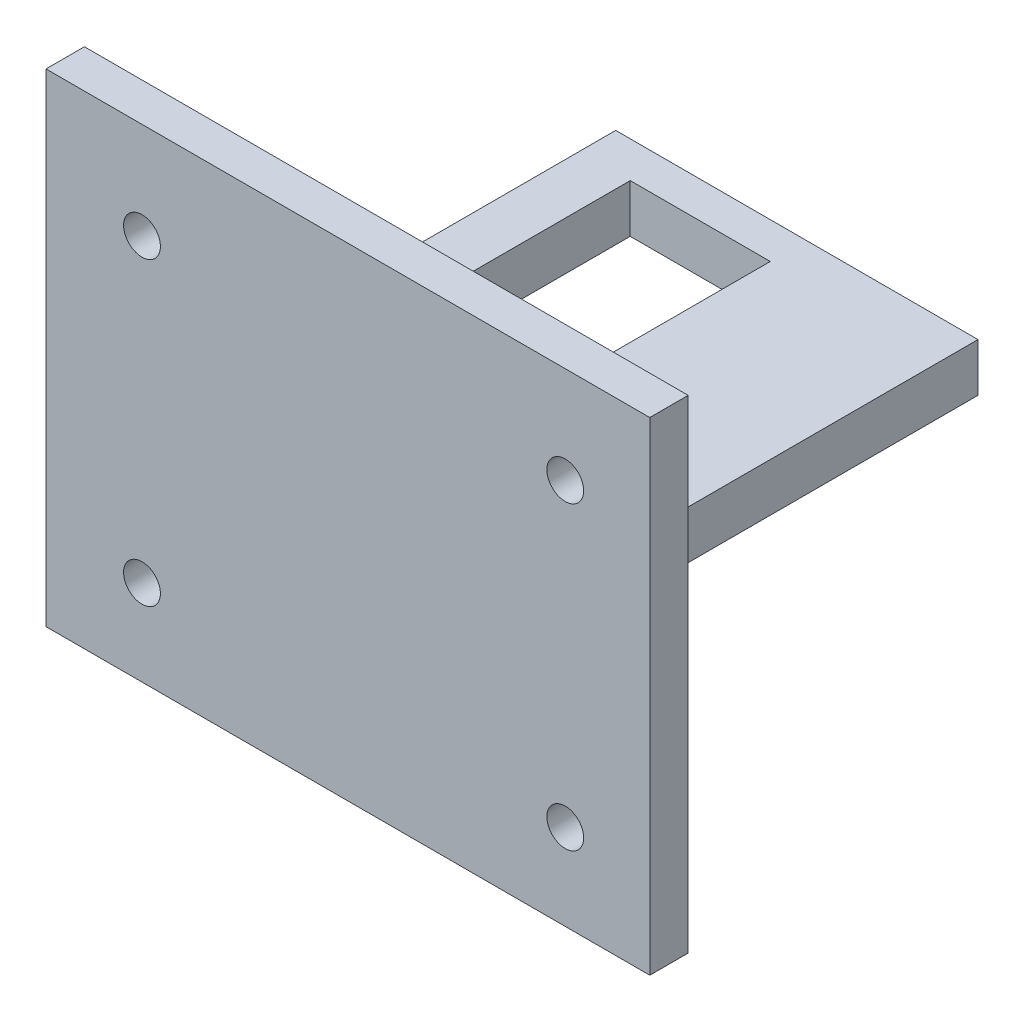
ISO-10303-21;
HEADER;
FILE_DESCRIPTION(('STEP AP214'),'2;1');
FILE_NAME('part.step','',(''),(''),'','','');
FILE_SCHEMA(('AUTOMOTIVE_DESIGN { 1 0 10303 214 1 1 1 1 }'));
ENDSEC;
DATA;
#1=APPLICATION_CONTEXT('core data for automotive mechanical design processes');
#2=APPLICATION_PROTOCOL_DEFINITION('international standard','automotive_design',2000,#1);
#3=PRODUCT_CONTEXT('',#1,'mechanical');
#4=PRODUCT('Part','Part','',(#3));
#5=PRODUCT_RELATED_PRODUCT_CATEGORY('part','',(#4));
#6=PRODUCT_DEFINITION_FORMATION('','',#4);
#7=PRODUCT_DEFINITION_CONTEXT('part definition',#1,'design');
#8=PRODUCT_DEFINITION('design','',#6,#7);
#9=PRODUCT_DEFINITION_SHAPE('','',#8);
#10=(LENGTH_UNIT() NAMED_UNIT(*) SI_UNIT(.MILLI.,.METRE.));
#11=(NAMED_UNIT(*) PLANE_ANGLE_UNIT() SI_UNIT($,.RADIAN.));
#12=(NAMED_UNIT(*) SI_UNIT($,.STERADIAN.) SOLID_ANGLE_UNIT());
#13=UNCERTAINTY_MEASURE_WITH_UNIT(LENGTH_MEASURE(1.E-05),#10,'distance_accuracy_value','');
#14=(GEOMETRIC_REPRESENTATION_CONTEXT(3) GLOBAL_UNCERTAINTY_ASSIGNED_CONTEXT((#13)) GLOBAL_UNIT_ASSIGNED_CONTEXT((#10,
#11,#12)) REPRESENTATION_CONTEXT('',''));
#15=CARTESIAN_POINT('',(0.,0.,0.));
#16=DIRECTION('',(0.,0.,1.));
#17=DIRECTION('',(1.,0.,0.));
#18=AXIS2_PLACEMENT_3D('',#15,#16,#17);
#19=CARTESIAN_POINT('',(15.,2.,-36.));
#20=DIRECTION('',(0.,-1.,0.));
#21=DIRECTION('',(0.,0.,-1.));
#22=AXIS2_PLACEMENT_3D('',#19,#20,#21);
#23=PLANE('',#22);
#24=DIRECTION('',(0.,0.,1.));
#25=VECTOR('',#24,1.);
#26=CARTESIAN_POINT('',(15.,2.,-36.));
#27=LINE('',#26,#25);
#28=CARTESIAN_POINT('',(15.,2.,-34.));
#29=VERTEX_POINT('',#28);
#30=CARTESIAN_POINT('',(15.,2.,0.));
#31=VERTEX_POINT('',#30);
#32=EDGE_CURVE('E158',#29,#31,#27,.T.);
#33=ORIENTED_EDGE('',*,*,#32,.F.);
#34=DIRECTION('',(-1.,0.,0.));
#35=VECTOR('',#34,1.);
#36=CARTESIAN_POINT('',(15.,2.,-34.));
#37=LINE('',#36,#35);
#38=CARTESIAN_POINT('',(-15.,2.,-34.));
#39=VERTEX_POINT('',#38);
#40=EDGE_CURVE('E55',#29,#39,#37,.T.);
#41=ORIENTED_EDGE('',*,*,#40,.T.);
#42=DIRECTION('',(0.,0.,1.));
#43=VECTOR('',#42,1.);
#44=CARTESIAN_POINT('',(-15.,2.,-36.));
#45=LINE('',#44,#43);
#46=CARTESIAN_POINT('',(-15.,2.,0.));
#47=VERTEX_POINT('',#46);
#48=EDGE_CURVE('E162',#39,#47,#45,.T.);
#49=ORIENTED_EDGE('',*,*,#48,.T.);
#50=DIRECTION('',(1.,0.,0.));
#51=VECTOR('',#50,1.);
#52=CARTESIAN_POINT('',(15.,2.,0.));
#53=LINE('',#52,#51);
#54=EDGE_CURVE('E247',#47,#31,#53,.T.);
#55=ORIENTED_EDGE('',*,*,#54,.T.);
#56=EDGE_LOOP('',(#33,#41,#49,#55));
#57=FACE_BOUND('',#56,.T.);
#58=CARTESIAN_POINT('',(-5.00000000000001,2.,-6.325));
#59=DIRECTION('',(0.,-1.,0.));
#60=DIRECTION('',(0.,0.,-1.));
#61=AXIS2_PLACEMENT_3D('',#58,#59,#60);
#62=CIRCLE('',#61,1.);
#63=CARTESIAN_POINT('',(-5.00000000000001,2.,-7.325));
#64=VERTEX_POINT('',#63);
#65=EDGE_CURVE('E217',#64,#64,#62,.T.);
#66=ORIENTED_EDGE('',*,*,#65,.T.);
#67=EDGE_LOOP('',(#66));
#68=FACE_BOUND('',#67,.T.);
#69=DIRECTION('',(0.,0.,-1.));
#70=VECTOR('',#69,1.);
#71=CARTESIAN_POINT('',(0.799999999999993,2.,-36.));
#72=LINE('',#71,#70);
#73=CARTESIAN_POINT('',(0.799999999999994,2.,-8.9));
#74=VERTEX_POINT('',#73);
#75=CARTESIAN_POINT('',(0.799999999999993,2.,-31.));
#76=VERTEX_POINT('',#75);
#77=EDGE_CURVE('E254',#74,#76,#72,.T.);
#78=ORIENTED_EDGE('',*,*,#77,.F.);
#79=DIRECTION('',(-1.,0.,0.));
#80=VECTOR('',#79,1.);
#81=CARTESIAN_POINT('',(15.,2.,-8.9));
#82=LINE('',#81,#80);
#83=CARTESIAN_POINT('',(-10.8,2.,-8.9));
#84=VERTEX_POINT('',#83);
#85=EDGE_CURVE('E260',#74,#84,#82,.T.);
#86=ORIENTED_EDGE('',*,*,#85,.T.);
#87=DIRECTION('',(0.,0.,-1.));
#88=VECTOR('',#87,1.);
#89=CARTESIAN_POINT('',(-10.8,2.,-36.));
#90=LINE('',#89,#88);
#91=CARTESIAN_POINT('',(-10.8,2.,-31.));
#92=VERTEX_POINT('',#91);
#93=EDGE_CURVE('E264',#84,#92,#90,.T.);
#94=ORIENTED_EDGE('',*,*,#93,.T.);
#95=DIRECTION('',(-1.,0.,0.));
#96=VECTOR('',#95,1.);
#97=CARTESIAN_POINT('',(15.,2.,-31.));
#98=LINE('',#97,#96);
#99=EDGE_CURVE('E268',#76,#92,#98,.T.);
#100=ORIENTED_EDGE('',*,*,#99,.F.);
#101=EDGE_LOOP('',(#78,#86,#94,#100));
#102=FACE_BOUND('',#101,.T.);
#103=ADVANCED_FACE('F39',(#57,#68,#102),#23,.F.);
#104=CARTESIAN_POINT('',(15.,-2.,-36.));
#105=DIRECTION('',(0.,1.,0.));
#106=DIRECTION('',(0.,0.,1.));
#107=AXIS2_PLACEMENT_3D('',#104,#105,#106);
#108=PLANE('',#107);
#109=DIRECTION('',(0.,0.,1.));
#110=VECTOR('',#109,1.);
#111=CARTESIAN_POINT('',(-15.,-2.,-36.));
#112=LINE('',#111,#110);
#113=CARTESIAN_POINT('',(-15.,-2.,-34.));
#114=VERTEX_POINT('',#113);
#115=CARTESIAN_POINT('',(-15.,-2.,-3.));
#116=VERTEX_POINT('',#115);
#117=EDGE_CURVE('E151',#114,#116,#112,.T.);
#118=ORIENTED_EDGE('',*,*,#117,.F.);
#119=DIRECTION('',(-1.,0.,0.));
#120=VECTOR('',#119,1.);
#121=CARTESIAN_POINT('',(15.,-2.,-34.));
#122=LINE('',#121,#120);
#123=CARTESIAN_POINT('',(15.,-2.,-34.));
#124=VERTEX_POINT('',#123);
#125=EDGE_CURVE('E137',#124,#114,#122,.T.);
#126=ORIENTED_EDGE('',*,*,#125,.F.);
#127=DIRECTION('',(0.,0.,1.));
#128=VECTOR('',#127,1.);
#129=CARTESIAN_POINT('',(15.,-2.,-36.));
#130=LINE('',#129,#128);
#131=CARTESIAN_POINT('',(15.,-2.,-3.));
#132=VERTEX_POINT('',#131);
#133=EDGE_CURVE('E150',#124,#132,#130,.T.);
#134=ORIENTED_EDGE('',*,*,#133,.T.);
#135=DIRECTION('',(-1.,0.,0.));
#136=VECTOR('',#135,1.);
#137=CARTESIAN_POINT('',(-15.,-2.,-3.));
#138=LINE('',#137,#136);
#139=EDGE_CURVE('E232',#132,#116,#138,.T.);
#140=ORIENTED_EDGE('',*,*,#139,.T.);
#141=EDGE_LOOP('',(#118,#126,#134,#140));
#142=FACE_BOUND('',#141,.T.);
#143=CARTESIAN_POINT('',(-5.00000000000001,-2.,-6.325));
#144=DIRECTION('',(0.,1.,0.));
#145=DIRECTION('',(0.,0.,1.));
#146=AXIS2_PLACEMENT_3D('',#143,#144,#145);
#147=CIRCLE('',#146,1.);
#148=CARTESIAN_POINT('',(-5.00000000000001,-2.,-5.325));
#149=VERTEX_POINT('',#148);
#150=EDGE_CURVE('E213',#149,#149,#147,.T.);
#151=ORIENTED_EDGE('',*,*,#150,.T.);
#152=EDGE_LOOP('',(#151));
#153=FACE_BOUND('',#152,.T.);
#154=DIRECTION('',(0.,0.,1.));
#155=VECTOR('',#154,1.);
#156=CARTESIAN_POINT('',(0.799999999999993,-2.,-36.));
#157=LINE('',#156,#155);
#158=CARTESIAN_POINT('',(0.799999999999994,-2.,-31.));
#159=VERTEX_POINT('',#158);
#160=CARTESIAN_POINT('',(0.799999999999994,-2.,-8.9));
#161=VERTEX_POINT('',#160);
#162=EDGE_CURVE('E229',#159,#161,#157,.T.);
#163=ORIENTED_EDGE('',*,*,#162,.F.);
#164=DIRECTION('',(1.,0.,0.));
#165=VECTOR('',#164,1.);
#166=CARTESIAN_POINT('',(15.,-2.,-31.));
#167=LINE('',#166,#165);
#168=CARTESIAN_POINT('',(-10.8,-2.,-31.));
#169=VERTEX_POINT('',#168);
#170=EDGE_CURVE('E212',#169,#159,#167,.T.);
#171=ORIENTED_EDGE('',*,*,#170,.F.);
#172=DIRECTION('',(0.,0.,1.));
#173=VECTOR('',#172,1.);
#174=CARTESIAN_POINT('',(-10.8,-2.,-36.));
#175=LINE('',#174,#173);
#176=CARTESIAN_POINT('',(-10.8,-2.,-8.9));
#177=VERTEX_POINT('',#176);
#178=EDGE_CURVE('E221',#169,#177,#175,.T.);
#179=ORIENTED_EDGE('',*,*,#178,.T.);
#180=DIRECTION('',(1.,0.,0.));
#181=VECTOR('',#180,1.);
#182=CARTESIAN_POINT('',(15.,-2.,-8.9));
#183=LINE('',#182,#181);
#184=EDGE_CURVE('E225',#177,#161,#183,.T.);
#185=ORIENTED_EDGE('',*,*,#184,.T.);
#186=EDGE_LOOP('',(#163,#171,#179,#185));
#187=FACE_BOUND('',#186,.T.);
#188=ADVANCED_FACE('F147',(#142,#153,#187),#108,.F.);
#189=CARTESIAN_POINT('',(0.,0.,0.));
#190=DIRECTION('',(0.,0.,1.));
#191=DIRECTION('',(1.,0.,0.));
#192=AXIS2_PLACEMENT_3D('',#189,#190,#191);
#193=PLANE('',#192);
#194=CARTESIAN_POINT('',(18.,-12.8899999991965,0.));
#195=DIRECTION('',(0.,0.,-1.));
#196=DIRECTION('',(-1.,0.,0.));
#197=AXIS2_PLACEMENT_3D('',#194,#195,#196);
#198=CIRCLE('',#197,1.52499999976507);
#199=CARTESIAN_POINT('',(16.4750000002349,-12.8899999991965,0.));
#200=VERTEX_POINT('',#199);
#201=EDGE_CURVE('E297',#200,#200,#198,.T.);
#202=ORIENTED_EDGE('',*,*,#201,.F.);
#203=EDGE_LOOP('',(#202));
#204=FACE_BOUND('',#203,.T.);
#205=CARTESIAN_POINT('',(-17.05,-12.8899999991965,0.));
#206=DIRECTION('',(0.,0.,-1.));
#207=DIRECTION('',(-1.,0.,0.));
#208=AXIS2_PLACEMENT_3D('',#205,#206,#207);
#209=CIRCLE('',#208,1.52499999976507);
#210=CARTESIAN_POINT('',(-18.5749999997651,-12.8899999991965,0.));
#211=VERTEX_POINT('',#210);
#212=EDGE_CURVE('E305',#211,#211,#209,.T.);
#213=ORIENTED_EDGE('',*,*,#212,.F.);
#214=EDGE_LOOP('',(#213));
#215=FACE_BOUND('',#214,.T.);
#216=CARTESIAN_POINT('',(-17.0502,12.,0.));
#217=DIRECTION('',(0.,0.,-1.));
#218=DIRECTION('',(-1.,0.,0.));
#219=AXIS2_PLACEMENT_3D('',#216,#217,#218);
#220=CIRCLE('',#219,1.525);
#221=CARTESIAN_POINT('',(-18.5752,12.,0.));
#222=VERTEX_POINT('',#221);
#223=EDGE_CURVE('E313',#222,#222,#220,.T.);
#224=ORIENTED_EDGE('',*,*,#223,.F.);
#225=EDGE_LOOP('',(#224));
#226=FACE_BOUND('',#225,.T.);
#227=CARTESIAN_POINT('',(18.,12.,0.));
#228=DIRECTION('',(0.,0.,-1.));
#229=DIRECTION('',(-1.,0.,0.));
#230=AXIS2_PLACEMENT_3D('',#227,#228,#229);
#231=CIRCLE('',#230,1.525);
#232=CARTESIAN_POINT('',(16.475,12.,0.));
#233=VERTEX_POINT('',#232);
#234=EDGE_CURVE('E289',#233,#233,#231,.T.);
#235=ORIENTED_EDGE('',*,*,#234,.F.);
#236=EDGE_LOOP('',(#235));
#237=FACE_BOUND('',#236,.T.);
#238=DIRECTION('',(0.,-1.,0.));
#239=VECTOR('',#238,1.);
#240=CARTESIAN_POINT('',(-25.,-20.,0.));
#241=LINE('',#240,#239);
#242=CARTESIAN_POINT('',(-25.,20.,0.));
#243=VERTEX_POINT('',#242);
#244=CARTESIAN_POINT('',(-25.,-20.,0.));
#245=VERTEX_POINT('',#244);
#246=EDGE_CURVE('E170',#243,#245,#241,.T.);
#247=ORIENTED_EDGE('',*,*,#246,.F.);
#248=DIRECTION('',(-1.,0.,0.));
#249=VECTOR('',#248,1.);
#250=CARTESIAN_POINT('',(25.,20.,0.));
#251=LINE('',#250,#249);
#252=CARTESIAN_POINT('',(25.,20.,0.));
#253=VERTEX_POINT('',#252);
#254=EDGE_CURVE('E176',#253,#243,#251,.T.);
#255=ORIENTED_EDGE('',*,*,#254,.F.);
#256=DIRECTION('',(0.,1.,0.));
#257=VECTOR('',#256,1.);
#258=CARTESIAN_POINT('',(25.,-20.,0.));
#259=LINE('',#258,#257);
#260=CARTESIAN_POINT('',(25.,-20.,0.));
#261=VERTEX_POINT('',#260);
#262=EDGE_CURVE('E192',#261,#253,#259,.T.);
#263=ORIENTED_EDGE('',*,*,#262,.F.);
#264=DIRECTION('',(1.,0.,0.));
#265=VECTOR('',#264,1.);
#266=CARTESIAN_POINT('',(25.,-20.,0.));
#267=LINE('',#266,#265);
#268=EDGE_CURVE('E189',#245,#261,#267,.T.);
#269=ORIENTED_EDGE('',*,*,#268,.F.);
#270=EDGE_LOOP('',(#247,#255,#263,#269));
#271=FACE_BOUND('',#270,.T.);
#272=DIRECTION('',(0.,1.,0.));
#273=VECTOR('',#272,1.);
#274=CARTESIAN_POINT('',(-15.,2.,0.));
#275=LINE('',#274,#273);
#276=CARTESIAN_POINT('',(-15.,-5.,0.));
#277=VERTEX_POINT('',#276);
#278=EDGE_CURVE('E63',#277,#47,#275,.T.);
#279=ORIENTED_EDGE('',*,*,#278,.F.);
#280=DIRECTION('',(-1.,0.,0.));
#281=VECTOR('',#280,1.);
#282=CARTESIAN_POINT('',(15.,-5.,0.));
#283=LINE('',#282,#281);
#284=CARTESIAN_POINT('',(15.,-5.,0.));
#285=VERTEX_POINT('',#284);
#286=EDGE_CURVE('E235',#277,#285,#283,.F.);
#287=ORIENTED_EDGE('',*,*,#286,.T.);
#288=DIRECTION('',(0.,-1.,0.));
#289=VECTOR('',#288,1.);
#290=CARTESIAN_POINT('',(15.,2.,0.));
#291=LINE('',#290,#289);
#292=EDGE_CURVE('E164',#31,#285,#291,.T.);
#293=ORIENTED_EDGE('',*,*,#292,.F.);
#294=ORIENTED_EDGE('',*,*,#54,.F.);
#295=EDGE_LOOP('',(#279,#287,#293,#294));
#296=FACE_BOUND('',#295,.T.);
#297=ADVANCED_FACE('F245',(#204,#215,#226,#237,#271,#296),#193,.F.);
#298=CARTESIAN_POINT('',(-25.,-20.,3.18));
#299=DIRECTION('',(1.,0.,0.));
#300=DIRECTION('',(0.,0.,-1.));
#301=AXIS2_PLACEMENT_3D('',#298,#299,#300);
#302=PLANE('',#301);
#303=ORIENTED_EDGE('',*,*,#246,.T.);
#304=DIRECTION('',(0.,0.,-1.));
#305=VECTOR('',#304,1.);
#306=CARTESIAN_POINT('',(-25.,-20.,3.18));
#307=LINE('',#306,#305);
#308=CARTESIAN_POINT('',(-25.,-20.,3.18));
#309=VERTEX_POINT('',#308);
#310=EDGE_CURVE('E208',#309,#245,#307,.T.);
#311=ORIENTED_EDGE('',*,*,#310,.F.);
#312=DIRECTION('',(0.,-1.,0.));
#313=VECTOR('',#312,1.);
#314=CARTESIAN_POINT('',(-25.,-20.,3.18));
#315=LINE('',#314,#313);
#316=CARTESIAN_POINT('',(-25.,20.,3.18));
#317=VERTEX_POINT('',#316);
#318=EDGE_CURVE('E171',#317,#309,#315,.T.);
#319=ORIENTED_EDGE('',*,*,#318,.F.);
#320=DIRECTION('',(0.,0.,-1.));
#321=VECTOR('',#320,1.);
#322=CARTESIAN_POINT('',(-25.,20.,3.18));
#323=LINE('',#322,#321);
#324=EDGE_CURVE('E185',#317,#243,#323,.T.);
#325=ORIENTED_EDGE('',*,*,#324,.T.);
#326=EDGE_LOOP('',(#303,#311,#319,#325));
#327=FACE_BOUND('',#326,.T.);
#328=ADVANCED_FACE('F338',(#327),#302,.F.);
#329=CARTESIAN_POINT('',(25.,-20.,3.18));
#330=DIRECTION('',(0.,1.,0.));
#331=DIRECTION('',(-1.,0.,0.));
#332=AXIS2_PLACEMENT_3D('',#329,#330,#331);
#333=PLANE('',#332);
#334=ORIENTED_EDGE('',*,*,#268,.T.);
#335=DIRECTION('',(0.,0.,-1.));
#336=VECTOR('',#335,1.);
#337=CARTESIAN_POINT('',(25.,-20.,3.18));
#338=LINE('',#337,#336);
#339=CARTESIAN_POINT('',(25.,-20.,3.18));
#340=VERTEX_POINT('',#339);
#341=EDGE_CURVE('E204',#340,#261,#338,.T.);
#342=ORIENTED_EDGE('',*,*,#341,.F.);
#343=DIRECTION('',(1.,0.,0.));
#344=VECTOR('',#343,1.);
#345=CARTESIAN_POINT('',(25.,-20.,3.18));
#346=LINE('',#345,#344);
#347=EDGE_CURVE('E175',#309,#340,#346,.T.);
#348=ORIENTED_EDGE('',*,*,#347,.F.);
#349=ORIENTED_EDGE('',*,*,#310,.T.);
#350=EDGE_LOOP('',(#334,#342,#348,#349));
#351=FACE_BOUND('',#350,.T.);
#352=ADVANCED_FACE('F359',(#351),#333,.F.);
#353=CARTESIAN_POINT('',(25.,-20.,3.18));
#354=DIRECTION('',(-1.,0.,0.));
#355=DIRECTION('',(0.,0.,1.));
#356=AXIS2_PLACEMENT_3D('',#353,#354,#355);
#357=PLANE('',#356);
#358=ORIENTED_EDGE('',*,*,#262,.T.);
#359=DIRECTION('',(0.,0.,-1.));
#360=VECTOR('',#359,1.);
#361=CARTESIAN_POINT('',(25.,20.,3.18));
#362=LINE('',#361,#360);
#363=CARTESIAN_POINT('',(25.,20.,3.18));
#364=VERTEX_POINT('',#363);
#365=EDGE_CURVE('E200',#364,#253,#362,.T.);
#366=ORIENTED_EDGE('',*,*,#365,.F.);
#367=DIRECTION('',(0.,1.,0.));
#368=VECTOR('',#367,1.);
#369=CARTESIAN_POINT('',(25.,-20.,3.18));
#370=LINE('',#369,#368);
#371=EDGE_CURVE('E179',#340,#364,#370,.T.);
#372=ORIENTED_EDGE('',*,*,#371,.F.);
#373=ORIENTED_EDGE('',*,*,#341,.T.);
#374=EDGE_LOOP('',(#358,#366,#372,#373));
#375=FACE_BOUND('',#374,.T.);
#376=ADVANCED_FACE('F356',(#375),#357,.F.);
#377=CARTESIAN_POINT('',(25.,20.,3.18));
#378=DIRECTION('',(0.,-1.,0.));
#379=DIRECTION('',(1.,0.,0.));
#380=AXIS2_PLACEMENT_3D('',#377,#378,#379);
#381=PLANE('',#380);
#382=ORIENTED_EDGE('',*,*,#254,.T.);
#383=ORIENTED_EDGE('',*,*,#324,.F.);
#384=DIRECTION('',(-1.,0.,0.));
#385=VECTOR('',#384,1.);
#386=CARTESIAN_POINT('',(25.,20.,3.18));
#387=LINE('',#386,#385);
#388=EDGE_CURVE('E182',#364,#317,#387,.T.);
#389=ORIENTED_EDGE('',*,*,#388,.F.);
#390=ORIENTED_EDGE('',*,*,#365,.T.);
#391=EDGE_LOOP('',(#382,#383,#389,#390));
#392=FACE_BOUND('',#391,.T.);
#393=ADVANCED_FACE('F352',(#392),#381,.F.);
#394=CARTESIAN_POINT('',(0.,0.,3.18));
#395=DIRECTION('',(0.,0.,1.));
#396=DIRECTION('',(1.,0.,0.));
#397=AXIS2_PLACEMENT_3D('',#394,#395,#396);
#398=PLANE('',#397);
#399=CARTESIAN_POINT('',(18.,-12.8899999991965,3.18));
#400=DIRECTION('',(0.,0.,-1.));
#401=DIRECTION('',(-1.,0.,0.));
#402=AXIS2_PLACEMENT_3D('',#399,#400,#401);
#403=CIRCLE('',#402,1.52499999976507);
#404=CARTESIAN_POINT('',(16.4750000002349,-12.8899999991965,3.18));
#405=VERTEX_POINT('',#404);
#406=EDGE_CURVE('E301',#405,#405,#403,.T.);
#407=ORIENTED_EDGE('',*,*,#406,.T.);
#408=EDGE_LOOP('',(#407));
#409=FACE_BOUND('',#408,.T.);
#410=CARTESIAN_POINT('',(-17.05,-12.8899999991965,3.18));
#411=DIRECTION('',(0.,0.,-1.));
#412=DIRECTION('',(-1.,0.,0.));
#413=AXIS2_PLACEMENT_3D('',#410,#411,#412);
#414=CIRCLE('',#413,1.52499999976507);
#415=CARTESIAN_POINT('',(-18.5749999997651,-12.8899999991965,3.18));
#416=VERTEX_POINT('',#415);
#417=EDGE_CURVE('E309',#416,#416,#414,.T.);
#418=ORIENTED_EDGE('',*,*,#417,.T.);
#419=EDGE_LOOP('',(#418));
#420=FACE_BOUND('',#419,.T.);
#421=CARTESIAN_POINT('',(-17.0502,12.,3.18));
#422=DIRECTION('',(0.,0.,-1.));
#423=DIRECTION('',(-1.,0.,0.));
#424=AXIS2_PLACEMENT_3D('',#421,#422,#423);
#425=CIRCLE('',#424,1.525);
#426=CARTESIAN_POINT('',(-18.5752,12.,3.18));
#427=VERTEX_POINT('',#426);
#428=EDGE_CURVE('E293',#427,#427,#425,.T.);
#429=ORIENTED_EDGE('',*,*,#428,.T.);
#430=EDGE_LOOP('',(#429));
#431=FACE_BOUND('',#430,.T.);
#432=CARTESIAN_POINT('',(18.,12.,3.18));
#433=DIRECTION('',(0.,0.,-1.));
#434=DIRECTION('',(-1.,0.,0.));
#435=AXIS2_PLACEMENT_3D('',#432,#433,#434);
#436=CIRCLE('',#435,1.525);
#437=CARTESIAN_POINT('',(16.475,12.,3.18));
#438=VERTEX_POINT('',#437);
#439=EDGE_CURVE('E278',#438,#438,#436,.T.);
#440=ORIENTED_EDGE('',*,*,#439,.T.);
#441=EDGE_LOOP('',(#440));
#442=FACE_BOUND('',#441,.T.);
#443=ORIENTED_EDGE('',*,*,#318,.T.);
#444=ORIENTED_EDGE('',*,*,#347,.T.);
#445=ORIENTED_EDGE('',*,*,#371,.T.);
#446=ORIENTED_EDGE('',*,*,#388,.T.);
#447=EDGE_LOOP('',(#443,#444,#445,#446));
#448=FACE_BOUND('',#447,.T.);
#449=ADVANCED_FACE('F325',(#409,#420,#431,#442,#448),#398,.T.);
#450=CARTESIAN_POINT('',(-15.,2.,-36.));
#451=DIRECTION('',(1.,0.,0.));
#452=DIRECTION('',(0.,1.,0.));
#453=AXIS2_PLACEMENT_3D('',#450,#451,#452);
#454=PLANE('',#453);
#455=ORIENTED_EDGE('',*,*,#48,.F.);
#456=DIRECTION('',(0.,-1.,0.));
#457=VECTOR('',#456,1.);
#458=CARTESIAN_POINT('',(-15.,20.,-34.));
#459=LINE('',#458,#457);
#460=EDGE_CURVE('E143',#39,#114,#459,.T.);
#461=ORIENTED_EDGE('',*,*,#460,.T.);
#462=ORIENTED_EDGE('',*,*,#117,.T.);
#463=CARTESIAN_POINT('',(-15.,-5.,-3.));
#464=DIRECTION('',(1.,0.,0.));
#465=DIRECTION('',(0.,1.,0.));
#466=AXIS2_PLACEMENT_3D('',#463,#464,#465);
#467=CIRCLE('',#466,3.);
#468=EDGE_CURVE('E48',#116,#277,#467,.T.);
#469=ORIENTED_EDGE('',*,*,#468,.T.);
#470=ORIENTED_EDGE('',*,*,#278,.T.);
#471=EDGE_LOOP('',(#455,#461,#462,#469,#470));
#472=FACE_BOUND('',#471,.T.);
#473=ADVANCED_FACE('F242',(#472),#454,.F.);
#474=CARTESIAN_POINT('',(15.,2.,-36.));
#475=DIRECTION('',(-1.,0.,0.));
#476=DIRECTION('',(0.,-1.,0.));
#477=AXIS2_PLACEMENT_3D('',#474,#475,#476);
#478=PLANE('',#477);
#479=ORIENTED_EDGE('',*,*,#133,.F.);
#480=DIRECTION('',(0.,-1.,0.));
#481=VECTOR('',#480,1.);
#482=CARTESIAN_POINT('',(15.,20.,-34.));
#483=LINE('',#482,#481);
#484=EDGE_CURVE('E134',#29,#124,#483,.T.);
#485=ORIENTED_EDGE('',*,*,#484,.F.);
#486=ORIENTED_EDGE('',*,*,#32,.T.);
#487=ORIENTED_EDGE('',*,*,#292,.T.);
#488=CARTESIAN_POINT('',(15.,-5.,-3.));
#489=DIRECTION('',(-1.,0.,0.));
#490=DIRECTION('',(0.,-1.,0.));
#491=AXIS2_PLACEMENT_3D('',#488,#489,#490);
#492=CIRCLE('',#491,3.);
#493=EDGE_CURVE('E11',#285,#132,#492,.T.);
#494=ORIENTED_EDGE('',*,*,#493,.T.);
#495=EDGE_LOOP('',(#479,#485,#486,#487,#494));
#496=FACE_BOUND('',#495,.T.);
#497=ADVANCED_FACE('F154',(#496),#478,.F.);
#498=CARTESIAN_POINT('',(-5.00000000000001,-20.,-6.325));
#499=DIRECTION('',(0.,1.,0.));
#500=DIRECTION('',(0.,0.,1.));
#501=AXIS2_PLACEMENT_3D('',#498,#499,#500);
#502=CYLINDRICAL_SURFACE('',#501,1.);
#503=ORIENTED_EDGE('',*,*,#150,.F.);
#504=EDGE_LOOP('',(#503));
#505=FACE_BOUND('',#504,.T.);
#506=ORIENTED_EDGE('',*,*,#65,.F.);
#507=EDGE_LOOP('',(#506));
#508=FACE_BOUND('',#507,.T.);
#509=ADVANCED_FACE('F379',(#505,#508),#502,.F.);
#510=CARTESIAN_POINT('',(0.799999999999994,-20.,0.));
#511=DIRECTION('',(-1.,0.,0.));
#512=DIRECTION('',(0.,0.,1.));
#513=AXIS2_PLACEMENT_3D('',#510,#511,#512);
#514=PLANE('',#513);
#515=ORIENTED_EDGE('',*,*,#77,.T.);
#516=DIRECTION('',(0.,1.,0.));
#517=VECTOR('',#516,1.);
#518=CARTESIAN_POINT('',(0.799999999999994,-20.,-31.));
#519=LINE('',#518,#517);
#520=EDGE_CURVE('E274',#159,#76,#519,.T.);
#521=ORIENTED_EDGE('',*,*,#520,.F.);
#522=ORIENTED_EDGE('',*,*,#162,.T.);
#523=DIRECTION('',(0.,1.,0.));
#524=VECTOR('',#523,1.);
#525=CARTESIAN_POINT('',(0.799999999999994,-20.,-8.9));
#526=LINE('',#525,#524);
#527=EDGE_CURVE('E218',#161,#74,#526,.T.);
#528=ORIENTED_EDGE('',*,*,#527,.T.);
#529=EDGE_LOOP('',(#515,#521,#522,#528));
#530=FACE_BOUND('',#529,.T.);
#531=ADVANCED_FACE('F383',(#530),#514,.T.);
#532=CARTESIAN_POINT('',(0.,-20.,-8.9));
#533=DIRECTION('',(0.,0.,1.));
#534=DIRECTION('',(1.,0.,0.));
#535=AXIS2_PLACEMENT_3D('',#532,#533,#534);
#536=PLANE('',#535);
#537=ORIENTED_EDGE('',*,*,#527,.F.);
#538=ORIENTED_EDGE('',*,*,#184,.F.);
#539=DIRECTION('',(0.,1.,0.));
#540=VECTOR('',#539,1.);
#541=CARTESIAN_POINT('',(-10.8,-20.,-8.9));
#542=LINE('',#541,#540);
#543=EDGE_CURVE('E282',#177,#84,#542,.T.);
#544=ORIENTED_EDGE('',*,*,#543,.T.);
#545=ORIENTED_EDGE('',*,*,#85,.F.);
#546=EDGE_LOOP('',(#537,#538,#544,#545));
#547=FACE_BOUND('',#546,.T.);
#548=ADVANCED_FACE('F387',(#547),#536,.F.);
#549=CARTESIAN_POINT('',(-10.8,-20.,0.));
#550=DIRECTION('',(-1.,0.,0.));
#551=DIRECTION('',(0.,0.,1.));
#552=AXIS2_PLACEMENT_3D('',#549,#550,#551);
#553=PLANE('',#552);
#554=ORIENTED_EDGE('',*,*,#543,.F.);
#555=ORIENTED_EDGE('',*,*,#178,.F.);
#556=DIRECTION('',(0.,1.,0.));
#557=VECTOR('',#556,1.);
#558=CARTESIAN_POINT('',(-10.8,-20.,-31.));
#559=LINE('',#558,#557);
#560=EDGE_CURVE('E277',#169,#92,#559,.T.);
#561=ORIENTED_EDGE('',*,*,#560,.T.);
#562=ORIENTED_EDGE('',*,*,#93,.F.);
#563=EDGE_LOOP('',(#554,#555,#561,#562));
#564=FACE_BOUND('',#563,.T.);
#565=ADVANCED_FACE('F392',(#564),#553,.F.);
#566=CARTESIAN_POINT('',(0.,-20.,-31.));
#567=DIRECTION('',(0.,0.,1.));
#568=DIRECTION('',(1.,0.,0.));
#569=AXIS2_PLACEMENT_3D('',#566,#567,#568);
#570=PLANE('',#569);
#571=ORIENTED_EDGE('',*,*,#99,.T.);
#572=ORIENTED_EDGE('',*,*,#560,.F.);
#573=ORIENTED_EDGE('',*,*,#170,.T.);
#574=ORIENTED_EDGE('',*,*,#520,.T.);
#575=EDGE_LOOP('',(#571,#572,#573,#574));
#576=FACE_BOUND('',#575,.T.);
#577=ADVANCED_FACE('F389',(#576),#570,.T.);
#578=CARTESIAN_POINT('',(18.,12.,3.18));
#579=DIRECTION('',(0.,0.,-1.));
#580=DIRECTION('',(-1.,0.,0.));
#581=AXIS2_PLACEMENT_3D('',#578,#579,#580);
#582=CYLINDRICAL_SURFACE('',#581,1.525);
#583=CARTESIAN_POINT('',(16.475,12.,3.18));
#584=CARTESIAN_POINT('',(16.475,12.,3.146875));
#585=CARTESIAN_POINT('',(16.475,12.,3.11375));
#586=CARTESIAN_POINT('',(16.475,12.,3.0475));
#587=CARTESIAN_POINT('',(16.475,12.,3.014375));
#588=CARTESIAN_POINT('',(16.475,12.,2.948125));
#589=CARTESIAN_POINT('',(16.475,12.,2.915));
#590=CARTESIAN_POINT('',(16.475,12.,2.84875));
#591=CARTESIAN_POINT('',(16.475,12.,2.815625));
#592=CARTESIAN_POINT('',(16.475,12.,2.749375));
#593=CARTESIAN_POINT('',(16.475,12.,2.71625));
#594=CARTESIAN_POINT('',(16.475,12.,2.65));
#595=CARTESIAN_POINT('',(16.475,12.,2.616875));
#596=CARTESIAN_POINT('',(16.475,12.,2.550625));
#597=CARTESIAN_POINT('',(16.475,12.,2.5175));
#598=CARTESIAN_POINT('',(16.475,12.,2.45125));
#599=CARTESIAN_POINT('',(16.475,12.,2.418125));
#600=CARTESIAN_POINT('',(16.475,12.,2.351875));
#601=CARTESIAN_POINT('',(16.475,12.,2.31875));
#602=CARTESIAN_POINT('',(16.475,12.,2.2525));
#603=CARTESIAN_POINT('',(16.475,12.,2.219375));
#604=CARTESIAN_POINT('',(16.475,12.,2.153125));
#605=CARTESIAN_POINT('',(16.475,12.,2.12));
#606=CARTESIAN_POINT('',(16.475,12.,2.05375));
#607=CARTESIAN_POINT('',(16.475,12.,2.020625));
#608=CARTESIAN_POINT('',(16.475,12.,1.954375));
#609=CARTESIAN_POINT('',(16.475,12.,1.92125));
#610=CARTESIAN_POINT('',(16.475,12.,1.855));
#611=CARTESIAN_POINT('',(16.475,12.,1.821875));
#612=CARTESIAN_POINT('',(16.475,12.,1.755625));
#613=CARTESIAN_POINT('',(16.475,12.,1.7225));
#614=CARTESIAN_POINT('',(16.475,12.,1.65625));
#615=CARTESIAN_POINT('',(16.475,12.,1.623125));
#616=CARTESIAN_POINT('',(16.475,12.,1.556875));
#617=CARTESIAN_POINT('',(16.475,12.,1.52375));
#618=CARTESIAN_POINT('',(16.475,12.,1.4575));
#619=CARTESIAN_POINT('',(16.475,12.,1.424375));
#620=CARTESIAN_POINT('',(16.475,12.,1.358125));
#621=CARTESIAN_POINT('',(16.475,12.,1.325));
#622=CARTESIAN_POINT('',(16.475,12.,1.25875));
#623=CARTESIAN_POINT('',(16.475,12.,1.225625));
#624=CARTESIAN_POINT('',(16.475,12.,1.159375));
#625=CARTESIAN_POINT('',(16.475,12.,1.12625));
#626=CARTESIAN_POINT('',(16.475,12.,1.06));
#627=CARTESIAN_POINT('',(16.475,12.,1.026875));
#628=CARTESIAN_POINT('',(16.475,12.,0.960625));
#629=CARTESIAN_POINT('',(16.475,12.,0.9275));
#630=CARTESIAN_POINT('',(16.475,12.,0.86125));
#631=CARTESIAN_POINT('',(16.475,12.,0.828125));
#632=CARTESIAN_POINT('',(16.475,12.,0.761875));
#633=CARTESIAN_POINT('',(16.475,12.,0.72875));
#634=CARTESIAN_POINT('',(16.475,12.,0.6625));
#635=CARTESIAN_POINT('',(16.475,12.,0.629375));
#636=CARTESIAN_POINT('',(16.475,12.,0.563125));
#637=CARTESIAN_POINT('',(16.475,12.,0.53));
#638=CARTESIAN_POINT('',(16.475,12.,0.46375));
#639=CARTESIAN_POINT('',(16.475,12.,0.430625));
#640=CARTESIAN_POINT('',(16.475,12.,0.364375));
#641=CARTESIAN_POINT('',(16.475,12.,0.33125));
#642=CARTESIAN_POINT('',(16.475,12.,0.265));
#643=CARTESIAN_POINT('',(16.475,12.,0.231875));
#644=CARTESIAN_POINT('',(16.475,12.,0.165625));
#645=CARTESIAN_POINT('',(16.475,12.,0.1325));
#646=CARTESIAN_POINT('',(16.475,12.,0.06625));
#647=CARTESIAN_POINT('',(16.475,12.,0.033125));
#648=CARTESIAN_POINT('',(16.475,12.,0.));
#649=B_SPLINE_CURVE_WITH_KNOTS('',3,(#583,#584,#585,#586,#587,#588,#589,#590,#591,#592,#593,
#594,#595,#596,#597,#598,#599,#600,#601,#602,#603,#604,#605,#606,#607,#608,#609,#610,#611,#612,
#613,#614,#615,#616,#617,#618,#619,#620,#621,#622,#623,#624,#625,#626,#627,#628,#629,#630,#631,
#632,#633,#634,#635,#636,#637,#638,#639,#640,#641,#642,#643,#644,#645,#646,#647,#648),
.UNSPECIFIED.,.F.,.F.,(4,2,2,2,2,2,2,2,2,2,2,2,2,2,2,2,2,2,2,2,2,2,2,2,2,2,2,2,2,2,2,2,4),(0.,
0.0993749999999996,0.19875,0.298125,0.3975,0.496875,0.59625,0.695625,0.795,0.894375,0.99375,
1.093125,1.1925,1.291875,1.39125,1.490625,1.59,1.689375,1.78875,1.888125,1.9875,2.086875,
2.18625,2.285625,2.385,2.484375,2.58375,2.683125,2.7825,2.881875,2.98125,3.080625,3.18),.UNSPECIFIED.);
#650=EDGE_CURVE('BSEAM332',#438,#233,#649,.T.);
#651=ORIENTED_EDGE('',*,*,#439,.F.);
#652=ORIENTED_EDGE('',*,*,#234,.T.);
#653=ORIENTED_EDGE('',*,*,#650,.T.);
#654=ORIENTED_EDGE('',*,*,#650,.F.);
#655=EDGE_LOOP('',(#651,#653,#652,#654));
#656=FACE_BOUND('',#655,.T.);
#657=ADVANCED_FACE('F332',(#656),#582,.F.);
#658=CARTESIAN_POINT('',(-17.0502,12.,3.18));
#659=DIRECTION('',(0.,0.,-1.));
#660=DIRECTION('',(-1.,0.,0.));
#661=AXIS2_PLACEMENT_3D('',#658,#659,#660);
#662=CYLINDRICAL_SURFACE('',#661,1.525);
#663=CARTESIAN_POINT('',(-18.5752,12.,3.18));
#664=CARTESIAN_POINT('',(-18.5752,12.,3.146875));
#665=CARTESIAN_POINT('',(-18.5752,12.,3.11375));
#666=CARTESIAN_POINT('',(-18.5752,12.,3.0475));
#667=CARTESIAN_POINT('',(-18.5752,12.,3.014375));
#668=CARTESIAN_POINT('',(-18.5752,12.,2.948125));
#669=CARTESIAN_POINT('',(-18.5752,12.,2.915));
#670=CARTESIAN_POINT('',(-18.5752,12.,2.84875));
#671=CARTESIAN_POINT('',(-18.5752,12.,2.815625));
#672=CARTESIAN_POINT('',(-18.5752,12.,2.749375));
#673=CARTESIAN_POINT('',(-18.5752,12.,2.71625));
#674=CARTESIAN_POINT('',(-18.5752,12.,2.65));
#675=CARTESIAN_POINT('',(-18.5752,12.,2.616875));
#676=CARTESIAN_POINT('',(-18.5752,12.,2.550625));
#677=CARTESIAN_POINT('',(-18.5752,12.,2.5175));
#678=CARTESIAN_POINT('',(-18.5752,12.,2.45125));
#679=CARTESIAN_POINT('',(-18.5752,12.,2.418125));
#680=CARTESIAN_POINT('',(-18.5752,12.,2.351875));
#681=CARTESIAN_POINT('',(-18.5752,12.,2.31875));
#682=CARTESIAN_POINT('',(-18.5752,12.,2.2525));
#683=CARTESIAN_POINT('',(-18.5752,12.,2.219375));
#684=CARTESIAN_POINT('',(-18.5752,12.,2.153125));
#685=CARTESIAN_POINT('',(-18.5752,12.,2.12));
#686=CARTESIAN_POINT('',(-18.5752,12.,2.05375));
#687=CARTESIAN_POINT('',(-18.5752,12.,2.020625));
#688=CARTESIAN_POINT('',(-18.5752,12.,1.954375));
#689=CARTESIAN_POINT('',(-18.5752,12.,1.92125));
#690=CARTESIAN_POINT('',(-18.5752,12.,1.855));
#691=CARTESIAN_POINT('',(-18.5752,12.,1.821875));
#692=CARTESIAN_POINT('',(-18.5752,12.,1.755625));
#693=CARTESIAN_POINT('',(-18.5752,12.,1.7225));
#694=CARTESIAN_POINT('',(-18.5752,12.,1.65625));
#695=CARTESIAN_POINT('',(-18.5752,12.,1.623125));
#696=CARTESIAN_POINT('',(-18.5752,12.,1.556875));
#697=CARTESIAN_POINT('',(-18.5752,12.,1.52375));
#698=CARTESIAN_POINT('',(-18.5752,12.,1.4575));
#699=CARTESIAN_POINT('',(-18.5752,12.,1.424375));
#700=CARTESIAN_POINT('',(-18.5752,12.,1.358125));
#701=CARTESIAN_POINT('',(-18.5752,12.,1.325));
#702=CARTESIAN_POINT('',(-18.5752,12.,1.25875));
#703=CARTESIAN_POINT('',(-18.5752,12.,1.225625));
#704=CARTESIAN_POINT('',(-18.5752,12.,1.159375));
#705=CARTESIAN_POINT('',(-18.5752,12.,1.12625));
#706=CARTESIAN_POINT('',(-18.5752,12.,1.06));
#707=CARTESIAN_POINT('',(-18.5752,12.,1.026875));
#708=CARTESIAN_POINT('',(-18.5752,12.,0.960625));
#709=CARTESIAN_POINT('',(-18.5752,12.,0.9275));
#710=CARTESIAN_POINT('',(-18.5752,12.,0.86125));
#711=CARTESIAN_POINT('',(-18.5752,12.,0.828125));
#712=CARTESIAN_POINT('',(-18.5752,12.,0.761875));
#713=CARTESIAN_POINT('',(-18.5752,12.,0.72875));
#714=CARTESIAN_POINT('',(-18.5752,12.,0.6625));
#715=CARTESIAN_POINT('',(-18.5752,12.,0.629375));
#716=CARTESIAN_POINT('',(-18.5752,12.,0.563125));
#717=CARTESIAN_POINT('',(-18.5752,12.,0.53));
#718=CARTESIAN_POINT('',(-18.5752,12.,0.46375));
#719=CARTESIAN_POINT('',(-18.5752,12.,0.430625));
#720=CARTESIAN_POINT('',(-18.5752,12.,0.364375));
#721=CARTESIAN_POINT('',(-18.5752,12.,0.33125));
#722=CARTESIAN_POINT('',(-18.5752,12.,0.265));
#723=CARTESIAN_POINT('',(-18.5752,12.,0.231875));
#724=CARTESIAN_POINT('',(-18.5752,12.,0.165625));
#725=CARTESIAN_POINT('',(-18.5752,12.,0.1325));
#726=CARTESIAN_POINT('',(-18.5752,12.,0.06625));
#727=CARTESIAN_POINT('',(-18.5752,12.,0.033125));
#728=CARTESIAN_POINT('',(-18.5752,12.,0.));
#729=B_SPLINE_CURVE_WITH_KNOTS('',3,(#663,#664,#665,#666,#667,#668,#669,#670,#671,#672,#673,
#674,#675,#676,#677,#678,#679,#680,#681,#682,#683,#684,#685,#686,#687,#688,#689,#690,#691,#692,
#693,#694,#695,#696,#697,#698,#699,#700,#701,#702,#703,#704,#705,#706,#707,#708,#709,#710,#711,
#712,#713,#714,#715,#716,#717,#718,#719,#720,#721,#722,#723,#724,#725,#726,#727,#728),
.UNSPECIFIED.,.F.,.F.,(4,2,2,2,2,2,2,2,2,2,2,2,2,2,2,2,2,2,2,2,2,2,2,2,2,2,2,2,2,2,2,2,4),(0.,
0.0993749999999996,0.19875,0.298125,0.3975,0.496875,0.59625,0.695625,0.795,0.894375,0.99375,
1.093125,1.1925,1.291875,1.39125,1.490625,1.59,1.689375,1.78875,1.888125,1.9875,2.086875,
2.18625,2.285625,2.385,2.484375,2.58375,2.683125,2.7825,2.881875,2.98125,3.080625,3.18),.UNSPECIFIED.);
#730=EDGE_CURVE('BSEAM328',#427,#222,#729,.T.);
#731=ORIENTED_EDGE('',*,*,#428,.F.);
#732=ORIENTED_EDGE('',*,*,#223,.T.);
#733=ORIENTED_EDGE('',*,*,#730,.T.);
#734=ORIENTED_EDGE('',*,*,#730,.F.);
#735=EDGE_LOOP('',(#731,#733,#732,#734));
#736=FACE_BOUND('',#735,.T.);
#737=ADVANCED_FACE('F328',(#736),#662,.F.);
#738=CARTESIAN_POINT('',(-17.05,-12.8899999991965,3.18));
#739=DIRECTION('',(0.,0.,-1.));
#740=DIRECTION('',(-1.,0.,0.));
#741=AXIS2_PLACEMENT_3D('',#738,#739,#740);
#742=CYLINDRICAL_SURFACE('',#741,1.52499999976507);
#743=CARTESIAN_POINT('',(-18.5749999997651,-12.8899999991965,3.18));
#744=CARTESIAN_POINT('',(-18.5749999997651,-12.8899999991965,3.146875));
#745=CARTESIAN_POINT('',(-18.5749999997651,-12.8899999991965,3.11375));
#746=CARTESIAN_POINT('',(-18.5749999997651,-12.8899999991965,3.0475));
#747=CARTESIAN_POINT('',(-18.5749999997651,-12.8899999991965,3.014375));
#748=CARTESIAN_POINT('',(-18.5749999997651,-12.8899999991965,2.948125));
#749=CARTESIAN_POINT('',(-18.5749999997651,-12.8899999991965,2.915));
#750=CARTESIAN_POINT('',(-18.5749999997651,-12.8899999991965,2.84875));
#751=CARTESIAN_POINT('',(-18.5749999997651,-12.8899999991965,2.815625));
#752=CARTESIAN_POINT('',(-18.5749999997651,-12.8899999991965,2.749375));
#753=CARTESIAN_POINT('',(-18.5749999997651,-12.8899999991965,2.71625));
#754=CARTESIAN_POINT('',(-18.5749999997651,-12.8899999991965,2.65));
#755=CARTESIAN_POINT('',(-18.5749999997651,-12.8899999991965,2.616875));
#756=CARTESIAN_POINT('',(-18.5749999997651,-12.8899999991965,2.550625));
#757=CARTESIAN_POINT('',(-18.5749999997651,-12.8899999991965,2.5175));
#758=CARTESIAN_POINT('',(-18.5749999997651,-12.8899999991965,2.45125));
#759=CARTESIAN_POINT('',(-18.5749999997651,-12.8899999991965,2.418125));
#760=CARTESIAN_POINT('',(-18.5749999997651,-12.8899999991965,2.351875));
#761=CARTESIAN_POINT('',(-18.5749999997651,-12.8899999991965,2.31875));
#762=CARTESIAN_POINT('',(-18.5749999997651,-12.8899999991965,2.2525));
#763=CARTESIAN_POINT('',(-18.5749999997651,-12.8899999991965,2.219375));
#764=CARTESIAN_POINT('',(-18.5749999997651,-12.8899999991965,2.153125));
#765=CARTESIAN_POINT('',(-18.5749999997651,-12.8899999991965,2.12));
#766=CARTESIAN_POINT('',(-18.5749999997651,-12.8899999991965,2.05375));
#767=CARTESIAN_POINT('',(-18.5749999997651,-12.8899999991965,2.020625));
#768=CARTESIAN_POINT('',(-18.5749999997651,-12.8899999991965,1.954375));
#769=CARTESIAN_POINT('',(-18.5749999997651,-12.8899999991965,1.92125));
#770=CARTESIAN_POINT('',(-18.5749999997651,-12.8899999991965,1.855));
#771=CARTESIAN_POINT('',(-18.5749999997651,-12.8899999991965,1.821875));
#772=CARTESIAN_POINT('',(-18.5749999997651,-12.8899999991965,1.755625));
#773=CARTESIAN_POINT('',(-18.5749999997651,-12.8899999991965,1.7225));
#774=CARTESIAN_POINT('',(-18.5749999997651,-12.8899999991965,1.65625));
#775=CARTESIAN_POINT('',(-18.5749999997651,-12.8899999991965,1.623125));
#776=CARTESIAN_POINT('',(-18.5749999997651,-12.8899999991965,1.556875));
#777=CARTESIAN_POINT('',(-18.5749999997651,-12.8899999991965,1.52375));
#778=CARTESIAN_POINT('',(-18.5749999997651,-12.8899999991965,1.4575));
#779=CARTESIAN_POINT('',(-18.5749999997651,-12.8899999991965,1.424375));
#780=CARTESIAN_POINT('',(-18.5749999997651,-12.8899999991965,1.358125));
#781=CARTESIAN_POINT('',(-18.5749999997651,-12.8899999991965,1.325));
#782=CARTESIAN_POINT('',(-18.5749999997651,-12.8899999991965,1.25875));
#783=CARTESIAN_POINT('',(-18.5749999997651,-12.8899999991965,1.225625));
#784=CARTESIAN_POINT('',(-18.5749999997651,-12.8899999991965,1.159375));
#785=CARTESIAN_POINT('',(-18.5749999997651,-12.8899999991965,1.12625));
#786=CARTESIAN_POINT('',(-18.5749999997651,-12.8899999991965,1.06));
#787=CARTESIAN_POINT('',(-18.5749999997651,-12.8899999991965,1.026875));
#788=CARTESIAN_POINT('',(-18.5749999997651,-12.8899999991965,0.960625));
#789=CARTESIAN_POINT('',(-18.5749999997651,-12.8899999991965,0.9275));
#790=CARTESIAN_POINT('',(-18.5749999997651,-12.8899999991965,0.86125));
#791=CARTESIAN_POINT('',(-18.5749999997651,-12.8899999991965,0.828125));
#792=CARTESIAN_POINT('',(-18.5749999997651,-12.8899999991965,0.761875));
#793=CARTESIAN_POINT('',(-18.5749999997651,-12.8899999991965,0.72875));
#794=CARTESIAN_POINT('',(-18.5749999997651,-12.8899999991965,0.6625));
#795=CARTESIAN_POINT('',(-18.5749999997651,-12.8899999991965,0.629375));
#796=CARTESIAN_POINT('',(-18.5749999997651,-12.8899999991965,0.563125));
#797=CARTESIAN_POINT('',(-18.5749999997651,-12.8899999991965,0.53));
#798=CARTESIAN_POINT('',(-18.5749999997651,-12.8899999991965,0.46375));
#799=CARTESIAN_POINT('',(-18.5749999997651,-12.8899999991965,0.430625));
#800=CARTESIAN_POINT('',(-18.5749999997651,-12.8899999991965,0.364375));
#801=CARTESIAN_POINT('',(-18.5749999997651,-12.8899999991965,0.33125));
#802=CARTESIAN_POINT('',(-18.5749999997651,-12.8899999991965,0.265));
#803=CARTESIAN_POINT('',(-18.5749999997651,-12.8899999991965,0.231875));
#804=CARTESIAN_POINT('',(-18.5749999997651,-12.8899999991965,0.165625));
#805=CARTESIAN_POINT('',(-18.5749999997651,-12.8899999991965,0.1325));
#806=CARTESIAN_POINT('',(-18.5749999997651,-12.8899999991965,0.06625));
#807=CARTESIAN_POINT('',(-18.5749999997651,-12.8899999991965,0.033125));
#808=CARTESIAN_POINT('',(-18.5749999997651,-12.8899999991965,0.));
#809=B_SPLINE_CURVE_WITH_KNOTS('',3,(#743,#744,#745,#746,#747,#748,#749,#750,#751,#752,#753,
#754,#755,#756,#757,#758,#759,#760,#761,#762,#763,#764,#765,#766,#767,#768,#769,#770,#771,#772,
#773,#774,#775,#776,#777,#778,#779,#780,#781,#782,#783,#784,#785,#786,#787,#788,#789,#790,#791,
#792,#793,#794,#795,#796,#797,#798,#799,#800,#801,#802,#803,#804,#805,#806,#807,#808),
.UNSPECIFIED.,.F.,.F.,(4,2,2,2,2,2,2,2,2,2,2,2,2,2,2,2,2,2,2,2,2,2,2,2,2,2,2,2,2,2,2,2,4),(0.,
0.0993749999999996,0.19875,0.298125,0.3975,0.496875,0.59625,0.695625,0.795,0.894375,0.99375,
1.093125,1.1925,1.291875,1.39125,1.490625,1.59,1.689375,1.78875,1.888125,1.9875,2.086875,
2.18625,2.285625,2.385,2.484375,2.58375,2.683125,2.7825,2.881875,2.98125,3.080625,3.18),.UNSPECIFIED.);
#810=EDGE_CURVE('BSEAM331',#416,#211,#809,.T.);
#811=ORIENTED_EDGE('',*,*,#417,.F.);
#812=ORIENTED_EDGE('',*,*,#212,.T.);
#813=ORIENTED_EDGE('',*,*,#810,.T.);
#814=ORIENTED_EDGE('',*,*,#810,.F.);
#815=EDGE_LOOP('',(#811,#813,#812,#814));
#816=FACE_BOUND('',#815,.T.);
#817=ADVANCED_FACE('F331',(#816),#742,.F.);
#818=CARTESIAN_POINT('',(18.,-12.8899999991965,3.18));
#819=DIRECTION('',(0.,0.,-1.));
#820=DIRECTION('',(-1.,0.,0.));
#821=AXIS2_PLACEMENT_3D('',#818,#819,#820);
#822=CYLINDRICAL_SURFACE('',#821,1.52499999976507);
#823=CARTESIAN_POINT('',(16.4750000002349,-12.8899999991965,3.18));
#824=CARTESIAN_POINT('',(16.4750000002349,-12.8899999991965,3.146875));
#825=CARTESIAN_POINT('',(16.4750000002349,-12.8899999991965,3.11375));
#826=CARTESIAN_POINT('',(16.4750000002349,-12.8899999991965,3.0475));
#827=CARTESIAN_POINT('',(16.4750000002349,-12.8899999991965,3.014375));
#828=CARTESIAN_POINT('',(16.4750000002349,-12.8899999991965,2.948125));
#829=CARTESIAN_POINT('',(16.4750000002349,-12.8899999991965,2.915));
#830=CARTESIAN_POINT('',(16.4750000002349,-12.8899999991965,2.84875));
#831=CARTESIAN_POINT('',(16.4750000002349,-12.8899999991965,2.815625));
#832=CARTESIAN_POINT('',(16.4750000002349,-12.8899999991965,2.749375));
#833=CARTESIAN_POINT('',(16.4750000002349,-12.8899999991965,2.71625));
#834=CARTESIAN_POINT('',(16.4750000002349,-12.8899999991965,2.65));
#835=CARTESIAN_POINT('',(16.4750000002349,-12.8899999991965,2.616875));
#836=CARTESIAN_POINT('',(16.4750000002349,-12.8899999991965,2.550625));
#837=CARTESIAN_POINT('',(16.4750000002349,-12.8899999991965,2.5175));
#838=CARTESIAN_POINT('',(16.4750000002349,-12.8899999991965,2.45125));
#839=CARTESIAN_POINT('',(16.4750000002349,-12.8899999991965,2.418125));
#840=CARTESIAN_POINT('',(16.4750000002349,-12.8899999991965,2.351875));
#841=CARTESIAN_POINT('',(16.4750000002349,-12.8899999991965,2.31875));
#842=CARTESIAN_POINT('',(16.4750000002349,-12.8899999991965,2.2525));
#843=CARTESIAN_POINT('',(16.4750000002349,-12.8899999991965,2.219375));
#844=CARTESIAN_POINT('',(16.4750000002349,-12.8899999991965,2.153125));
#845=CARTESIAN_POINT('',(16.4750000002349,-12.8899999991965,2.12));
#846=CARTESIAN_POINT('',(16.4750000002349,-12.8899999991965,2.05375));
#847=CARTESIAN_POINT('',(16.4750000002349,-12.8899999991965,2.020625));
#848=CARTESIAN_POINT('',(16.4750000002349,-12.8899999991965,1.954375));
#849=CARTESIAN_POINT('',(16.4750000002349,-12.8899999991965,1.92125));
#850=CARTESIAN_POINT('',(16.4750000002349,-12.8899999991965,1.855));
#851=CARTESIAN_POINT('',(16.4750000002349,-12.8899999991965,1.821875));
#852=CARTESIAN_POINT('',(16.4750000002349,-12.8899999991965,1.755625));
#853=CARTESIAN_POINT('',(16.4750000002349,-12.8899999991965,1.7225));
#854=CARTESIAN_POINT('',(16.4750000002349,-12.8899999991965,1.65625));
#855=CARTESIAN_POINT('',(16.4750000002349,-12.8899999991965,1.623125));
#856=CARTESIAN_POINT('',(16.4750000002349,-12.8899999991965,1.556875));
#857=CARTESIAN_POINT('',(16.4750000002349,-12.8899999991965,1.52375));
#858=CARTESIAN_POINT('',(16.4750000002349,-12.8899999991965,1.4575));
#859=CARTESIAN_POINT('',(16.4750000002349,-12.8899999991965,1.424375));
#860=CARTESIAN_POINT('',(16.4750000002349,-12.8899999991965,1.358125));
#861=CARTESIAN_POINT('',(16.4750000002349,-12.8899999991965,1.325));
#862=CARTESIAN_POINT('',(16.4750000002349,-12.8899999991965,1.25875));
#863=CARTESIAN_POINT('',(16.4750000002349,-12.8899999991965,1.225625));
#864=CARTESIAN_POINT('',(16.4750000002349,-12.8899999991965,1.159375));
#865=CARTESIAN_POINT('',(16.4750000002349,-12.8899999991965,1.12625));
#866=CARTESIAN_POINT('',(16.4750000002349,-12.8899999991965,1.06));
#867=CARTESIAN_POINT('',(16.4750000002349,-12.8899999991965,1.026875));
#868=CARTESIAN_POINT('',(16.4750000002349,-12.8899999991965,0.960625));
#869=CARTESIAN_POINT('',(16.4750000002349,-12.8899999991965,0.9275));
#870=CARTESIAN_POINT('',(16.4750000002349,-12.8899999991965,0.86125));
#871=CARTESIAN_POINT('',(16.4750000002349,-12.8899999991965,0.828125));
#872=CARTESIAN_POINT('',(16.4750000002349,-12.8899999991965,0.761875));
#873=CARTESIAN_POINT('',(16.4750000002349,-12.8899999991965,0.72875));
#874=CARTESIAN_POINT('',(16.4750000002349,-12.8899999991965,0.6625));
#875=CARTESIAN_POINT('',(16.4750000002349,-12.8899999991965,0.629375));
#876=CARTESIAN_POINT('',(16.4750000002349,-12.8899999991965,0.563125));
#877=CARTESIAN_POINT('',(16.4750000002349,-12.8899999991965,0.53));
#878=CARTESIAN_POINT('',(16.4750000002349,-12.8899999991965,0.46375));
#879=CARTESIAN_POINT('',(16.4750000002349,-12.8899999991965,0.430625));
#880=CARTESIAN_POINT('',(16.4750000002349,-12.8899999991965,0.364375));
#881=CARTESIAN_POINT('',(16.4750000002349,-12.8899999991965,0.33125));
#882=CARTESIAN_POINT('',(16.4750000002349,-12.8899999991965,0.265));
#883=CARTESIAN_POINT('',(16.4750000002349,-12.8899999991965,0.231875));
#884=CARTESIAN_POINT('',(16.4750000002349,-12.8899999991965,0.165625));
#885=CARTESIAN_POINT('',(16.4750000002349,-12.8899999991965,0.1325));
#886=CARTESIAN_POINT('',(16.4750000002349,-12.8899999991965,0.06625));
#887=CARTESIAN_POINT('',(16.4750000002349,-12.8899999991965,0.033125));
#888=CARTESIAN_POINT('',(16.4750000002349,-12.8899999991965,0.));
#889=B_SPLINE_CURVE_WITH_KNOTS('',3,(#823,#824,#825,#826,#827,#828,#829,#830,#831,#832,#833,
#834,#835,#836,#837,#838,#839,#840,#841,#842,#843,#844,#845,#846,#847,#848,#849,#850,#851,#852,
#853,#854,#855,#856,#857,#858,#859,#860,#861,#862,#863,#864,#865,#866,#867,#868,#869,#870,#871,
#872,#873,#874,#875,#876,#877,#878,#879,#880,#881,#882,#883,#884,#885,#886,#887,#888),
.UNSPECIFIED.,.F.,.F.,(4,2,2,2,2,2,2,2,2,2,2,2,2,2,2,2,2,2,2,2,2,2,2,2,2,2,2,2,2,2,2,2,4),(0.,
0.0993749999999996,0.19875,0.298125,0.3975,0.496875,0.59625,0.695625,0.795,0.894375,0.99375,
1.093125,1.1925,1.291875,1.39125,1.490625,1.59,1.689375,1.78875,1.888125,1.9875,2.086875,
2.18625,2.285625,2.385,2.484375,2.58375,2.683125,2.7825,2.881875,2.98125,3.080625,3.18),.UNSPECIFIED.);
#890=EDGE_CURVE('BSEAM403',#405,#200,#889,.T.);
#891=ORIENTED_EDGE('',*,*,#406,.F.);
#892=ORIENTED_EDGE('',*,*,#201,.T.);
#893=ORIENTED_EDGE('',*,*,#890,.T.);
#894=ORIENTED_EDGE('',*,*,#890,.F.);
#895=EDGE_LOOP('',(#891,#893,#892,#894));
#896=FACE_BOUND('',#895,.T.);
#897=ADVANCED_FACE('F403',(#896),#822,.F.);
#898=CARTESIAN_POINT('',(15.,-5.,-3.));
#899=DIRECTION('',(1.,0.,0.));
#900=DIRECTION('',(0.,0.,-1.));
#901=AXIS2_PLACEMENT_3D('',#898,#899,#900);
#902=CYLINDRICAL_SURFACE('',#901,3.);
#903=ORIENTED_EDGE('',*,*,#493,.F.);
#904=ORIENTED_EDGE('',*,*,#286,.F.);
#905=ORIENTED_EDGE('',*,*,#468,.F.);
#906=ORIENTED_EDGE('',*,*,#139,.F.);
#907=EDGE_LOOP('',(#903,#904,#905,#906));
#908=FACE_BOUND('',#907,.T.);
#909=ADVANCED_FACE('F41',(#908),#902,.F.);
#910=CARTESIAN_POINT('',(15.,20.,-34.));
#911=DIRECTION('',(0.,0.,1.));
#912=DIRECTION('',(1.,0.,0.));
#913=AXIS2_PLACEMENT_3D('',#910,#911,#912);
#914=PLANE('',#913);
#915=ORIENTED_EDGE('',*,*,#484,.T.);
#916=ORIENTED_EDGE('',*,*,#125,.T.);
#917=ORIENTED_EDGE('',*,*,#460,.F.);
#918=ORIENTED_EDGE('',*,*,#40,.F.);
#919=EDGE_LOOP('',(#915,#916,#917,#918));
#920=FACE_BOUND('',#919,.T.);
#921=ADVANCED_FACE('F136',(#920),#914,.F.);
#922=CLOSED_SHELL('',(#103,#188,#297,#328,#352,#376,#393,#449,#473,#497,#509,#531,#548,#565,
#577,#657,#737,#817,#897,#909,#921));
#923=MANIFOLD_SOLID_BREP('B2',#922);
#924=ADVANCED_BREP_SHAPE_REPRESENTATION('',(#18,#923),#14);
#925=SHAPE_DEFINITION_REPRESENTATION(#9,#924);
ENDSEC;
END-ISO-10303-21;
